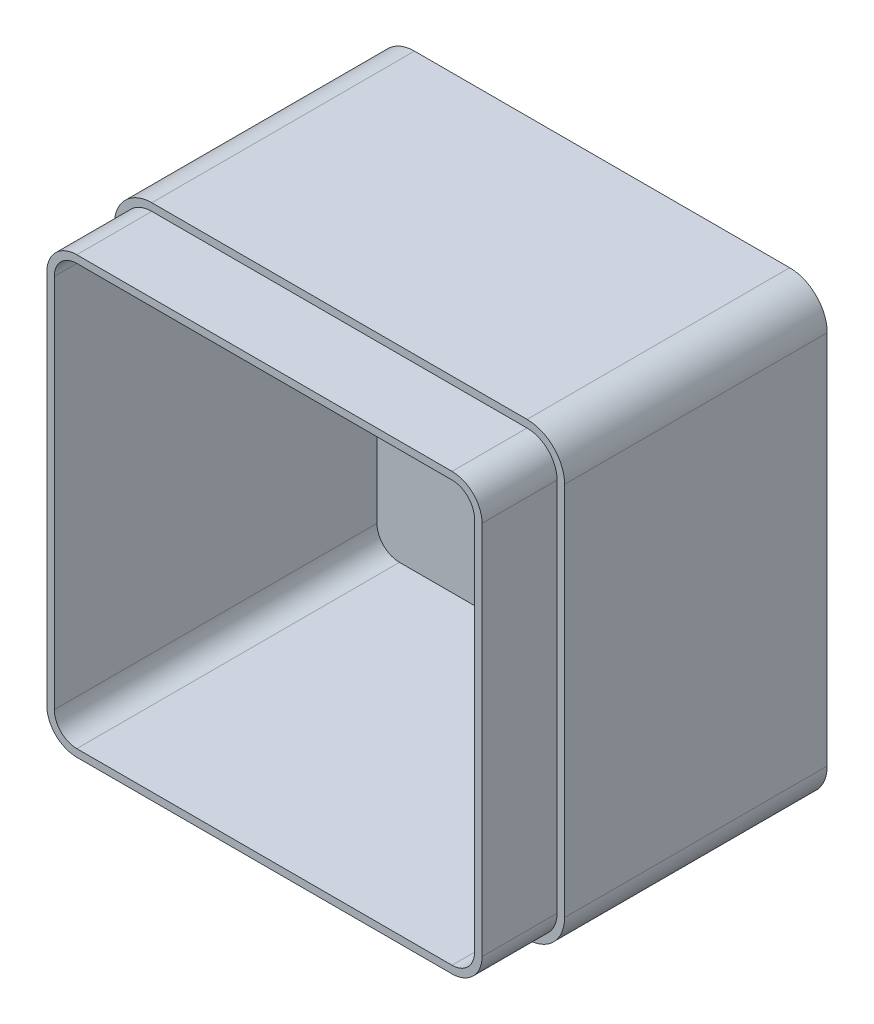
ISO-10303-21;
HEADER;
FILE_DESCRIPTION(('STEP AP214'),'2;1');
FILE_NAME('part.step','',(''),(''),'','','');
FILE_SCHEMA(('AUTOMOTIVE_DESIGN { 1 0 10303 214 1 1 1 1 }'));
ENDSEC;
DATA;
#1=APPLICATION_CONTEXT('core data for automotive mechanical design processes');
#2=APPLICATION_PROTOCOL_DEFINITION('international standard','automotive_design',2000,#1);
#3=PRODUCT_CONTEXT('',#1,'mechanical');
#4=PRODUCT('Part','Part','',(#3));
#5=PRODUCT_RELATED_PRODUCT_CATEGORY('part','',(#4));
#6=PRODUCT_DEFINITION_FORMATION('','',#4);
#7=PRODUCT_DEFINITION_CONTEXT('part definition',#1,'design');
#8=PRODUCT_DEFINITION('design','',#6,#7);
#9=PRODUCT_DEFINITION_SHAPE('','',#8);
#10=(LENGTH_UNIT() NAMED_UNIT(*) SI_UNIT(.MILLI.,.METRE.));
#11=(NAMED_UNIT(*) PLANE_ANGLE_UNIT() SI_UNIT($,.RADIAN.));
#12=(NAMED_UNIT(*) SI_UNIT($,.STERADIAN.) SOLID_ANGLE_UNIT());
#13=UNCERTAINTY_MEASURE_WITH_UNIT(LENGTH_MEASURE(1.E-05),#10,'distance_accuracy_value','');
#14=(GEOMETRIC_REPRESENTATION_CONTEXT(3) GLOBAL_UNCERTAINTY_ASSIGNED_CONTEXT((#13)) GLOBAL_UNIT_ASSIGNED_CONTEXT((#10,
#11,#12)) REPRESENTATION_CONTEXT('',''));
#15=CARTESIAN_POINT('',(0.,0.,0.));
#16=DIRECTION('',(0.,0.,1.));
#17=DIRECTION('',(1.,0.,0.));
#18=AXIS2_PLACEMENT_3D('',#15,#16,#17);
#19=CARTESIAN_POINT('',(0.,0.,90.));
#20=DIRECTION('',(0.,0.,-1.));
#21=DIRECTION('',(-1.,0.,0.));
#22=AXIS2_PLACEMENT_3D('',#19,#20,#21);
#23=PLANE('',#22);
#24=DIRECTION('',(0.,-1.,0.));
#25=VECTOR('',#24,1.);
#26=CARTESIAN_POINT('',(-116.,0.,90.));
#27=LINE('',#26,#25);
#28=CARTESIAN_POINT('',(-116.,-9.99999999999999,90.));
#29=VERTEX_POINT('',#28);
#30=CARTESIAN_POINT('',(-116.,-110.,90.));
#31=VERTEX_POINT('',#30);
#32=EDGE_CURVE('E392',#29,#31,#27,.T.);
#33=ORIENTED_EDGE('',*,*,#32,.F.);
#34=CARTESIAN_POINT('',(-110.,-10.,90.));
#35=DIRECTION('',(0.,0.,-1.));
#36=DIRECTION('',(-1.,0.,0.));
#37=AXIS2_PLACEMENT_3D('',#34,#35,#36);
#38=CIRCLE('',#37,6.);
#39=CARTESIAN_POINT('',(-110.,-4.,90.));
#40=VERTEX_POINT('',#39);
#41=EDGE_CURVE('E374',#40,#29,#38,.F.);
#42=ORIENTED_EDGE('',*,*,#41,.F.);
#43=DIRECTION('',(-1.,0.,0.));
#44=VECTOR('',#43,1.);
#45=CARTESIAN_POINT('',(0.,-4.,90.));
#46=LINE('',#45,#44);
#47=CARTESIAN_POINT('',(-9.99999999999999,-4.,90.));
#48=VERTEX_POINT('',#47);
#49=EDGE_CURVE('E385',#48,#40,#46,.T.);
#50=ORIENTED_EDGE('',*,*,#49,.F.);
#51=CARTESIAN_POINT('',(-9.99999999999999,-10.,90.));
#52=DIRECTION('',(0.,0.,-1.));
#53=DIRECTION('',(-1.,0.,0.));
#54=AXIS2_PLACEMENT_3D('',#51,#52,#53);
#55=CIRCLE('',#54,6.);
#56=CARTESIAN_POINT('',(-4.,-10.,90.));
#57=VERTEX_POINT('',#56);
#58=EDGE_CURVE('E386',#57,#48,#55,.F.);
#59=ORIENTED_EDGE('',*,*,#58,.F.);
#60=DIRECTION('',(0.,1.,0.));
#61=VECTOR('',#60,1.);
#62=CARTESIAN_POINT('',(-4.,0.,90.));
#63=LINE('',#62,#61);
#64=CARTESIAN_POINT('',(-3.99999999999999,-110.,90.));
#65=VERTEX_POINT('',#64);
#66=EDGE_CURVE('E338',#65,#57,#63,.T.);
#67=ORIENTED_EDGE('',*,*,#66,.F.);
#68=CARTESIAN_POINT('',(-9.99999999999998,-110.,90.));
#69=DIRECTION('',(0.,0.,-1.));
#70=DIRECTION('',(-1.,0.,0.));
#71=AXIS2_PLACEMENT_3D('',#68,#69,#70);
#72=CIRCLE('',#71,6.);
#73=CARTESIAN_POINT('',(-9.99999999999998,-116.,90.));
#74=VERTEX_POINT('',#73);
#75=EDGE_CURVE('E389',#74,#65,#72,.F.);
#76=ORIENTED_EDGE('',*,*,#75,.F.);
#77=DIRECTION('',(1.,0.,0.));
#78=VECTOR('',#77,1.);
#79=CARTESIAN_POINT('',(0.,-116.,90.));
#80=LINE('',#79,#78);
#81=CARTESIAN_POINT('',(-110.,-116.,90.));
#82=VERTEX_POINT('',#81);
#83=EDGE_CURVE('E381',#82,#74,#80,.T.);
#84=ORIENTED_EDGE('',*,*,#83,.F.);
#85=CARTESIAN_POINT('',(-110.,-110.,90.));
#86=DIRECTION('',(0.,0.,-1.));
#87=DIRECTION('',(-1.,0.,0.));
#88=AXIS2_PLACEMENT_3D('',#85,#86,#87);
#89=CIRCLE('',#88,6.);
#90=EDGE_CURVE('E333',#31,#82,#89,.F.);
#91=ORIENTED_EDGE('',*,*,#90,.F.);
#92=EDGE_LOOP('',(#33,#42,#50,#59,#67,#76,#84,#91));
#93=FACE_BOUND('',#92,.T.);
#94=CARTESIAN_POINT('',(-110.,-10.,90.));
#95=DIRECTION('',(0.,0.,1.));
#96=DIRECTION('',(1.,0.,0.));
#97=AXIS2_PLACEMENT_3D('',#94,#95,#96);
#98=CIRCLE('',#97,7.99999999999999);
#99=CARTESIAN_POINT('',(-110.,-2.,90.));
#100=VERTEX_POINT('',#99);
#101=CARTESIAN_POINT('',(-118.,-9.99999999999999,90.));
#102=VERTEX_POINT('',#101);
#103=EDGE_CURVE('E256',#100,#102,#98,.T.);
#104=ORIENTED_EDGE('',*,*,#103,.T.);
#105=DIRECTION('',(0.,-1.,0.));
#106=VECTOR('',#105,1.);
#107=CARTESIAN_POINT('',(-118.,-9.99999999999999,90.));
#108=LINE('',#107,#106);
#109=CARTESIAN_POINT('',(-118.,-110.,90.));
#110=VERTEX_POINT('',#109);
#111=EDGE_CURVE('E206',#102,#110,#108,.T.);
#112=ORIENTED_EDGE('',*,*,#111,.T.);
#113=CARTESIAN_POINT('',(-110.,-110.,90.));
#114=DIRECTION('',(0.,0.,1.));
#115=DIRECTION('',(1.,0.,0.));
#116=AXIS2_PLACEMENT_3D('',#113,#114,#115);
#117=CIRCLE('',#116,8.00000000000001);
#118=CARTESIAN_POINT('',(-110.,-118.,90.));
#119=VERTEX_POINT('',#118);
#120=EDGE_CURVE('E55',#110,#119,#117,.T.);
#121=ORIENTED_EDGE('',*,*,#120,.T.);
#122=DIRECTION('',(1.,0.,0.));
#123=VECTOR('',#122,1.);
#124=CARTESIAN_POINT('',(-110.,-118.,90.));
#125=LINE('',#124,#123);
#126=CARTESIAN_POINT('',(-9.99999999999998,-118.,90.));
#127=VERTEX_POINT('',#126);
#128=EDGE_CURVE('E263',#119,#127,#125,.T.);
#129=ORIENTED_EDGE('',*,*,#128,.T.);
#130=CARTESIAN_POINT('',(-9.99999999999998,-110.,90.));
#131=DIRECTION('',(0.,0.,1.));
#132=DIRECTION('',(1.,0.,0.));
#133=AXIS2_PLACEMENT_3D('',#130,#131,#132);
#134=CIRCLE('',#133,8.);
#135=CARTESIAN_POINT('',(-1.99999999999998,-110.,90.));
#136=VERTEX_POINT('',#135);
#137=EDGE_CURVE('E267',#127,#136,#134,.T.);
#138=ORIENTED_EDGE('',*,*,#137,.T.);
#139=DIRECTION('',(0.,1.,0.));
#140=VECTOR('',#139,1.);
#141=CARTESIAN_POINT('',(-1.99999999999999,-110.,90.));
#142=LINE('',#141,#140);
#143=CARTESIAN_POINT('',(-1.99999999999999,-9.99999999999999,90.));
#144=VERTEX_POINT('',#143);
#145=EDGE_CURVE('E271',#136,#144,#142,.T.);
#146=ORIENTED_EDGE('',*,*,#145,.T.);
#147=CARTESIAN_POINT('',(-9.99999999999999,-10.,90.));
#148=DIRECTION('',(0.,0.,1.));
#149=DIRECTION('',(1.,0.,0.));
#150=AXIS2_PLACEMENT_3D('',#147,#148,#149);
#151=CIRCLE('',#150,8.);
#152=CARTESIAN_POINT('',(-9.99999999999999,-1.99999999999999,90.));
#153=VERTEX_POINT('',#152);
#154=EDGE_CURVE('E233',#144,#153,#151,.T.);
#155=ORIENTED_EDGE('',*,*,#154,.T.);
#156=DIRECTION('',(-1.,0.,0.));
#157=VECTOR('',#156,1.);
#158=CARTESIAN_POINT('',(-9.99999999999999,-2.,90.));
#159=LINE('',#158,#157);
#160=EDGE_CURVE('E229',#153,#100,#159,.T.);
#161=ORIENTED_EDGE('',*,*,#160,.T.);
#162=EDGE_LOOP('',(#104,#112,#121,#129,#138,#146,#155,#161));
#163=FACE_BOUND('',#162,.T.);
#164=ADVANCED_FACE('F39',(#93,#163),#23,.F.);
#165=CARTESIAN_POINT('',(-4.,0.,90.));
#166=DIRECTION('',(-1.,0.,0.));
#167=DIRECTION('',(0.,-1.,0.));
#168=AXIS2_PLACEMENT_3D('',#165,#166,#167);
#169=PLANE('',#168);
#170=ORIENTED_EDGE('',*,*,#66,.T.);
#171=DIRECTION('',(0.,0.,1.));
#172=VECTOR('',#171,1.);
#173=CARTESIAN_POINT('',(-4.,-10.,90.));
#174=LINE('',#173,#172);
#175=CARTESIAN_POINT('',(-4.,-10.,4.));
#176=VERTEX_POINT('',#175);
#177=EDGE_CURVE('E326',#176,#57,#174,.T.);
#178=ORIENTED_EDGE('',*,*,#177,.F.);
#179=DIRECTION('',(0.,1.,0.));
#180=VECTOR('',#179,1.);
#181=CARTESIAN_POINT('',(-4.,0.,4.));
#182=LINE('',#181,#180);
#183=CARTESIAN_POINT('',(-3.99999999999999,-110.,4.));
#184=VERTEX_POINT('',#183);
#185=EDGE_CURVE('E320',#184,#176,#182,.T.);
#186=ORIENTED_EDGE('',*,*,#185,.F.);
#187=DIRECTION('',(0.,0.,1.));
#188=VECTOR('',#187,1.);
#189=CARTESIAN_POINT('',(-3.99999999999999,-110.,90.));
#190=LINE('',#189,#188);
#191=EDGE_CURVE('E321',#65,#184,#190,.F.);
#192=ORIENTED_EDGE('',*,*,#191,.F.);
#193=EDGE_LOOP('',(#170,#178,#186,#192));
#194=FACE_BOUND('',#193,.T.);
#195=ADVANCED_FACE('F505',(#194),#169,.T.);
#196=CARTESIAN_POINT('',(0.,-4.,90.));
#197=DIRECTION('',(0.,-1.,0.));
#198=DIRECTION('',(0.,0.,-1.));
#199=AXIS2_PLACEMENT_3D('',#196,#197,#198);
#200=PLANE('',#199);
#201=ORIENTED_EDGE('',*,*,#49,.T.);
#202=DIRECTION('',(0.,0.,-1.));
#203=VECTOR('',#202,1.);
#204=CARTESIAN_POINT('',(-110.,-4.,90.));
#205=LINE('',#204,#203);
#206=CARTESIAN_POINT('',(-110.,-4.,4.));
#207=VERTEX_POINT('',#206);
#208=EDGE_CURVE('E325',#207,#40,#205,.F.);
#209=ORIENTED_EDGE('',*,*,#208,.F.);
#210=DIRECTION('',(-1.,0.,0.));
#211=VECTOR('',#210,1.);
#212=CARTESIAN_POINT('',(0.,-4.,4.));
#213=LINE('',#212,#211);
#214=CARTESIAN_POINT('',(-9.99999999999999,-4.,4.));
#215=VERTEX_POINT('',#214);
#216=EDGE_CURVE('E330',#215,#207,#213,.T.);
#217=ORIENTED_EDGE('',*,*,#216,.F.);
#218=DIRECTION('',(0.,0.,-1.));
#219=VECTOR('',#218,1.);
#220=CARTESIAN_POINT('',(-9.99999999999999,-4.,90.));
#221=LINE('',#220,#219);
#222=EDGE_CURVE('E360',#48,#215,#221,.T.);
#223=ORIENTED_EDGE('',*,*,#222,.F.);
#224=EDGE_LOOP('',(#201,#209,#217,#223));
#225=FACE_BOUND('',#224,.T.);
#226=ADVANCED_FACE('F510',(#225),#200,.T.);
#227=CARTESIAN_POINT('',(-116.,0.,90.));
#228=DIRECTION('',(1.,0.,0.));
#229=DIRECTION('',(0.,1.,0.));
#230=AXIS2_PLACEMENT_3D('',#227,#228,#229);
#231=PLANE('',#230);
#232=DIRECTION('',(0.,-1.,0.));
#233=VECTOR('',#232,1.);
#234=CARTESIAN_POINT('',(-116.,0.,4.));
#235=LINE('',#234,#233);
#236=CARTESIAN_POINT('',(-116.,-9.99999999999999,4.));
#237=VERTEX_POINT('',#236);
#238=CARTESIAN_POINT('',(-116.,-110.,4.));
#239=VERTEX_POINT('',#238);
#240=EDGE_CURVE('E339',#237,#239,#235,.T.);
#241=ORIENTED_EDGE('',*,*,#240,.F.);
#242=DIRECTION('',(0.,0.,1.));
#243=VECTOR('',#242,1.);
#244=CARTESIAN_POINT('',(-116.,-9.99999999999999,90.));
#245=LINE('',#244,#243);
#246=EDGE_CURVE('E343',#29,#237,#245,.F.);
#247=ORIENTED_EDGE('',*,*,#246,.F.);
#248=ORIENTED_EDGE('',*,*,#32,.T.);
#249=DIRECTION('',(0.,0.,1.));
#250=VECTOR('',#249,1.);
#251=CARTESIAN_POINT('',(-116.,-110.,90.));
#252=LINE('',#251,#250);
#253=EDGE_CURVE('E371',#239,#31,#252,.T.);
#254=ORIENTED_EDGE('',*,*,#253,.F.);
#255=EDGE_LOOP('',(#241,#247,#248,#254));
#256=FACE_BOUND('',#255,.T.);
#257=ADVANCED_FACE('F539',(#256),#231,.T.);
#258=CARTESIAN_POINT('',(0.,-116.,90.));
#259=DIRECTION('',(0.,1.,0.));
#260=DIRECTION('',(-1.,0.,0.));
#261=AXIS2_PLACEMENT_3D('',#258,#259,#260);
#262=PLANE('',#261);
#263=ORIENTED_EDGE('',*,*,#83,.T.);
#264=DIRECTION('',(0.,0.,1.));
#265=VECTOR('',#264,1.);
#266=CARTESIAN_POINT('',(-9.99999999999998,-116.,90.));
#267=LINE('',#266,#265);
#268=CARTESIAN_POINT('',(-9.99999999999998,-116.,4.));
#269=VERTEX_POINT('',#268);
#270=EDGE_CURVE('E378',#269,#74,#267,.T.);
#271=ORIENTED_EDGE('',*,*,#270,.F.);
#272=DIRECTION('',(1.,0.,0.));
#273=VECTOR('',#272,1.);
#274=CARTESIAN_POINT('',(0.,-116.,4.));
#275=LINE('',#274,#273);
#276=CARTESIAN_POINT('',(-110.,-116.,4.));
#277=VERTEX_POINT('',#276);
#278=EDGE_CURVE('E334',#277,#269,#275,.T.);
#279=ORIENTED_EDGE('',*,*,#278,.F.);
#280=DIRECTION('',(0.,0.,1.));
#281=VECTOR('',#280,1.);
#282=CARTESIAN_POINT('',(-110.,-116.,90.));
#283=LINE('',#282,#281);
#284=EDGE_CURVE('E352',#82,#277,#283,.F.);
#285=ORIENTED_EDGE('',*,*,#284,.F.);
#286=EDGE_LOOP('',(#263,#271,#279,#285));
#287=FACE_BOUND('',#286,.T.);
#288=ADVANCED_FACE('F535',(#287),#262,.T.);
#289=CARTESIAN_POINT('',(0.,0.,4.));
#290=DIRECTION('',(0.,0.,-1.));
#291=DIRECTION('',(-1.,0.,0.));
#292=AXIS2_PLACEMENT_3D('',#289,#290,#291);
#293=PLANE('',#292);
#294=ORIENTED_EDGE('',*,*,#278,.T.);
#295=CARTESIAN_POINT('',(-9.99999999999998,-110.,4.));
#296=DIRECTION('',(0.,0.,-1.));
#297=DIRECTION('',(-1.,0.,0.));
#298=AXIS2_PLACEMENT_3D('',#295,#296,#297);
#299=CIRCLE('',#298,6.);
#300=EDGE_CURVE('E344',#184,#269,#299,.T.);
#301=ORIENTED_EDGE('',*,*,#300,.F.);
#302=ORIENTED_EDGE('',*,*,#185,.T.);
#303=CARTESIAN_POINT('',(-9.99999999999999,-10.,4.));
#304=DIRECTION('',(0.,0.,-1.));
#305=DIRECTION('',(-1.,0.,0.));
#306=AXIS2_PLACEMENT_3D('',#303,#304,#305);
#307=CIRCLE('',#306,6.);
#308=EDGE_CURVE('E351',#215,#176,#307,.T.);
#309=ORIENTED_EDGE('',*,*,#308,.F.);
#310=ORIENTED_EDGE('',*,*,#216,.T.);
#311=CARTESIAN_POINT('',(-110.,-10.,4.));
#312=DIRECTION('',(0.,0.,-1.));
#313=DIRECTION('',(-1.,0.,0.));
#314=AXIS2_PLACEMENT_3D('',#311,#312,#313);
#315=CIRCLE('',#314,6.);
#316=EDGE_CURVE('E348',#237,#207,#315,.T.);
#317=ORIENTED_EDGE('',*,*,#316,.F.);
#318=ORIENTED_EDGE('',*,*,#240,.T.);
#319=CARTESIAN_POINT('',(-110.,-110.,4.));
#320=DIRECTION('',(0.,0.,-1.));
#321=DIRECTION('',(-1.,0.,0.));
#322=AXIS2_PLACEMENT_3D('',#319,#320,#321);
#323=CIRCLE('',#322,6.);
#324=EDGE_CURVE('E340',#277,#239,#323,.T.);
#325=ORIENTED_EDGE('',*,*,#324,.F.);
#326=EDGE_LOOP('',(#294,#301,#302,#309,#310,#317,#318,#325));
#327=FACE_BOUND('',#326,.T.);
#328=ADVANCED_FACE('F531',(#327),#293,.F.);
#329=CARTESIAN_POINT('',(-110.,-110.,90.));
#330=DIRECTION('',(0.,0.,-1.));
#331=DIRECTION('',(-1.,0.,0.));
#332=AXIS2_PLACEMENT_3D('',#329,#330,#331);
#333=CYLINDRICAL_SURFACE('',#332,6.);
#334=ORIENTED_EDGE('',*,*,#90,.T.);
#335=ORIENTED_EDGE('',*,*,#284,.T.);
#336=ORIENTED_EDGE('',*,*,#324,.T.);
#337=ORIENTED_EDGE('',*,*,#253,.T.);
#338=EDGE_LOOP('',(#334,#335,#336,#337));
#339=FACE_BOUND('',#338,.T.);
#340=ADVANCED_FACE('F527',(#339),#333,.F.);
#341=CARTESIAN_POINT('',(-9.99999999999998,-110.,90.));
#342=DIRECTION('',(0.,0.,-1.));
#343=DIRECTION('',(-1.,0.,0.));
#344=AXIS2_PLACEMENT_3D('',#341,#342,#343);
#345=CYLINDRICAL_SURFACE('',#344,6.);
#346=ORIENTED_EDGE('',*,*,#75,.T.);
#347=ORIENTED_EDGE('',*,*,#191,.T.);
#348=ORIENTED_EDGE('',*,*,#300,.T.);
#349=ORIENTED_EDGE('',*,*,#270,.T.);
#350=EDGE_LOOP('',(#346,#347,#348,#349));
#351=FACE_BOUND('',#350,.T.);
#352=ADVANCED_FACE('F523',(#351),#345,.F.);
#353=CARTESIAN_POINT('',(-9.99999999999999,-10.,90.));
#354=DIRECTION('',(0.,0.,-1.));
#355=DIRECTION('',(-1.,0.,0.));
#356=AXIS2_PLACEMENT_3D('',#353,#354,#355);
#357=CYLINDRICAL_SURFACE('',#356,6.);
#358=ORIENTED_EDGE('',*,*,#58,.T.);
#359=ORIENTED_EDGE('',*,*,#222,.T.);
#360=ORIENTED_EDGE('',*,*,#308,.T.);
#361=ORIENTED_EDGE('',*,*,#177,.T.);
#362=EDGE_LOOP('',(#358,#359,#360,#361));
#363=FACE_BOUND('',#362,.T.);
#364=ADVANCED_FACE('F519',(#363),#357,.F.);
#365=CARTESIAN_POINT('',(-110.,-10.,90.));
#366=DIRECTION('',(0.,0.,-1.));
#367=DIRECTION('',(-1.,0.,0.));
#368=AXIS2_PLACEMENT_3D('',#365,#366,#367);
#369=CYLINDRICAL_SURFACE('',#368,6.);
#370=ORIENTED_EDGE('',*,*,#41,.T.);
#371=ORIENTED_EDGE('',*,*,#246,.T.);
#372=ORIENTED_EDGE('',*,*,#316,.T.);
#373=ORIENTED_EDGE('',*,*,#208,.T.);
#374=EDGE_LOOP('',(#370,#371,#372,#373));
#375=FACE_BOUND('',#374,.T.);
#376=ADVANCED_FACE('F516',(#375),#369,.F.);
#377=CARTESIAN_POINT('',(-110.,-10.,70.));
#378=DIRECTION('',(0.,0.,1.));
#379=DIRECTION('',(1.,0.,0.));
#380=AXIS2_PLACEMENT_3D('',#377,#378,#379);
#381=PLANE('',#380);
#382=DIRECTION('',(-1.,0.,0.));
#383=VECTOR('',#382,1.);
#384=CARTESIAN_POINT('',(-9.99999999999999,-2.,70.));
#385=LINE('',#384,#383);
#386=CARTESIAN_POINT('',(-9.99999999999999,-1.99999999999999,70.));
#387=VERTEX_POINT('',#386);
#388=CARTESIAN_POINT('',(-110.,-2.,70.));
#389=VERTEX_POINT('',#388);
#390=EDGE_CURVE('E213',#387,#389,#385,.T.);
#391=ORIENTED_EDGE('',*,*,#390,.F.);
#392=CARTESIAN_POINT('',(-9.99999999999999,-10.,70.));
#393=DIRECTION('',(0.,0.,1.));
#394=DIRECTION('',(1.,0.,0.));
#395=AXIS2_PLACEMENT_3D('',#392,#393,#394);
#396=CIRCLE('',#395,8.);
#397=CARTESIAN_POINT('',(-1.99999999999999,-9.99999999999999,70.));
#398=VERTEX_POINT('',#397);
#399=EDGE_CURVE('E250',#398,#387,#396,.T.);
#400=ORIENTED_EDGE('',*,*,#399,.F.);
#401=DIRECTION('',(0.,1.,0.));
#402=VECTOR('',#401,1.);
#403=CARTESIAN_POINT('',(-1.99999999999999,-110.,70.));
#404=LINE('',#403,#402);
#405=CARTESIAN_POINT('',(-1.99999999999998,-110.,70.));
#406=VERTEX_POINT('',#405);
#407=EDGE_CURVE('E246',#406,#398,#404,.T.);
#408=ORIENTED_EDGE('',*,*,#407,.F.);
#409=CARTESIAN_POINT('',(-9.99999999999998,-110.,70.));
#410=DIRECTION('',(0.,0.,1.));
#411=DIRECTION('',(1.,0.,0.));
#412=AXIS2_PLACEMENT_3D('',#409,#410,#411);
#413=CIRCLE('',#412,8.);
#414=CARTESIAN_POINT('',(-9.99999999999998,-118.,70.));
#415=VERTEX_POINT('',#414);
#416=EDGE_CURVE('E242',#415,#406,#413,.T.);
#417=ORIENTED_EDGE('',*,*,#416,.F.);
#418=DIRECTION('',(1.,0.,0.));
#419=VECTOR('',#418,1.);
#420=CARTESIAN_POINT('',(-110.,-118.,70.));
#421=LINE('',#420,#419);
#422=CARTESIAN_POINT('',(-110.,-118.,70.));
#423=VERTEX_POINT('',#422);
#424=EDGE_CURVE('E238',#423,#415,#421,.T.);
#425=ORIENTED_EDGE('',*,*,#424,.F.);
#426=CARTESIAN_POINT('',(-110.,-110.,70.));
#427=DIRECTION('',(0.,0.,1.));
#428=DIRECTION('',(1.,0.,0.));
#429=AXIS2_PLACEMENT_3D('',#426,#427,#428);
#430=CIRCLE('',#429,8.00000000000001);
#431=CARTESIAN_POINT('',(-118.,-110.,70.));
#432=VERTEX_POINT('',#431);
#433=EDGE_CURVE('E223',#432,#423,#430,.T.);
#434=ORIENTED_EDGE('',*,*,#433,.F.);
#435=DIRECTION('',(0.,-1.,0.));
#436=VECTOR('',#435,1.);
#437=CARTESIAN_POINT('',(-118.,-9.99999999999999,70.));
#438=LINE('',#437,#436);
#439=CARTESIAN_POINT('',(-118.,-9.99999999999999,70.));
#440=VERTEX_POINT('',#439);
#441=EDGE_CURVE('E204',#440,#432,#438,.T.);
#442=ORIENTED_EDGE('',*,*,#441,.F.);
#443=CARTESIAN_POINT('',(-110.,-10.,70.));
#444=DIRECTION('',(0.,0.,1.));
#445=DIRECTION('',(1.,0.,0.));
#446=AXIS2_PLACEMENT_3D('',#443,#444,#445);
#447=CIRCLE('',#446,7.99999999999999);
#448=EDGE_CURVE('E219',#389,#440,#447,.T.);
#449=ORIENTED_EDGE('',*,*,#448,.F.);
#450=EDGE_LOOP('',(#391,#400,#408,#417,#425,#434,#442,#449));
#451=FACE_BOUND('',#450,.T.);
#452=CARTESIAN_POINT('',(-110.,-10.,70.));
#453=DIRECTION('',(0.,0.,1.));
#454=DIRECTION('',(1.,0.,0.));
#455=AXIS2_PLACEMENT_3D('',#452,#453,#454);
#456=CIRCLE('',#455,9.99999999999999);
#457=CARTESIAN_POINT('',(-110.,0.,70.));
#458=VERTEX_POINT('',#457);
#459=CARTESIAN_POINT('',(-120.,-9.99999999999999,70.));
#460=VERTEX_POINT('',#459);
#461=EDGE_CURVE('E280',#458,#460,#456,.T.);
#462=ORIENTED_EDGE('',*,*,#461,.T.);
#463=DIRECTION('',(0.,-1.,0.));
#464=VECTOR('',#463,1.);
#465=CARTESIAN_POINT('',(-120.,-9.99999999999999,70.));
#466=LINE('',#465,#464);
#467=CARTESIAN_POINT('',(-120.,-110.,70.));
#468=VERTEX_POINT('',#467);
#469=EDGE_CURVE('E300',#460,#468,#466,.T.);
#470=ORIENTED_EDGE('',*,*,#469,.T.);
#471=CARTESIAN_POINT('',(-110.,-110.,70.));
#472=DIRECTION('',(0.,0.,1.));
#473=DIRECTION('',(1.,0.,0.));
#474=AXIS2_PLACEMENT_3D('',#471,#472,#473);
#475=CIRCLE('',#474,9.99999999999999);
#476=CARTESIAN_POINT('',(-110.,-120.,70.));
#477=VERTEX_POINT('',#476);
#478=EDGE_CURVE('E303',#468,#477,#475,.T.);
#479=ORIENTED_EDGE('',*,*,#478,.T.);
#480=DIRECTION('',(1.,0.,0.));
#481=VECTOR('',#480,1.);
#482=CARTESIAN_POINT('',(-110.,-120.,70.));
#483=LINE('',#482,#481);
#484=CARTESIAN_POINT('',(-9.99999999999998,-120.,70.));
#485=VERTEX_POINT('',#484);
#486=EDGE_CURVE('E306',#477,#485,#483,.T.);
#487=ORIENTED_EDGE('',*,*,#486,.T.);
#488=CARTESIAN_POINT('',(-9.99999999999998,-110.,70.));
#489=DIRECTION('',(0.,0.,1.));
#490=DIRECTION('',(1.,0.,0.));
#491=AXIS2_PLACEMENT_3D('',#488,#489,#490);
#492=CIRCLE('',#491,9.99999999999999);
#493=CARTESIAN_POINT('',(0.,-110.,70.));
#494=VERTEX_POINT('',#493);
#495=EDGE_CURVE('E309',#485,#494,#492,.T.);
#496=ORIENTED_EDGE('',*,*,#495,.T.);
#497=DIRECTION('',(0.,1.,0.));
#498=VECTOR('',#497,1.);
#499=CARTESIAN_POINT('',(0.,-110.,70.));
#500=LINE('',#499,#498);
#501=CARTESIAN_POINT('',(0.,-10.,70.));
#502=VERTEX_POINT('',#501);
#503=EDGE_CURVE('E312',#494,#502,#500,.T.);
#504=ORIENTED_EDGE('',*,*,#503,.T.);
#505=CARTESIAN_POINT('',(-9.99999999999999,-10.,70.));
#506=DIRECTION('',(0.,0.,1.));
#507=DIRECTION('',(1.,0.,0.));
#508=AXIS2_PLACEMENT_3D('',#505,#506,#507);
#509=CIRCLE('',#508,10.);
#510=CARTESIAN_POINT('',(-9.99999999999999,0.,70.));
#511=VERTEX_POINT('',#510);
#512=EDGE_CURVE('E315',#502,#511,#509,.T.);
#513=ORIENTED_EDGE('',*,*,#512,.T.);
#514=DIRECTION('',(-1.,0.,0.));
#515=VECTOR('',#514,1.);
#516=CARTESIAN_POINT('',(-9.99999999999999,0.,70.));
#517=LINE('',#516,#515);
#518=EDGE_CURVE('E63',#511,#458,#517,.T.);
#519=ORIENTED_EDGE('',*,*,#518,.T.);
#520=EDGE_LOOP('',(#462,#470,#479,#487,#496,#504,#513,#519));
#521=FACE_BOUND('',#520,.T.);
#522=ADVANCED_FACE('F218',(#451,#521),#381,.T.);
#523=CARTESIAN_POINT('',(-110.,-10.,70.));
#524=DIRECTION('',(0.,0.,1.));
#525=DIRECTION('',(1.,0.,0.));
#526=AXIS2_PLACEMENT_3D('',#523,#524,#525);
#527=CYLINDRICAL_SURFACE('',#526,7.99999999999999);
#528=ORIENTED_EDGE('',*,*,#103,.F.);
#529=DIRECTION('',(0.,0.,1.));
#530=VECTOR('',#529,1.);
#531=CARTESIAN_POINT('',(-110.,-2.,70.));
#532=LINE('',#531,#530);
#533=EDGE_CURVE('E227',#389,#100,#532,.T.);
#534=ORIENTED_EDGE('',*,*,#533,.F.);
#535=ORIENTED_EDGE('',*,*,#448,.T.);
#536=DIRECTION('',(0.,0.,1.));
#537=VECTOR('',#536,1.);
#538=CARTESIAN_POINT('',(-118.,-9.99999999999999,70.));
#539=LINE('',#538,#537);
#540=EDGE_CURVE('E201',#440,#102,#539,.T.);
#541=ORIENTED_EDGE('',*,*,#540,.T.);
#542=EDGE_LOOP('',(#528,#534,#535,#541));
#543=FACE_BOUND('',#542,.T.);
#544=ADVANCED_FACE('F226',(#543),#527,.T.);
#545=CARTESIAN_POINT('',(-9.99999999999999,-2.,70.));
#546=DIRECTION('',(0.,1.,0.));
#547=DIRECTION('',(0.,0.,1.));
#548=AXIS2_PLACEMENT_3D('',#545,#546,#547);
#549=PLANE('',#548);
#550=ORIENTED_EDGE('',*,*,#160,.F.);
#551=DIRECTION('',(0.,0.,1.));
#552=VECTOR('',#551,1.);
#553=CARTESIAN_POINT('',(-9.99999999999999,-1.99999999999999,70.));
#554=LINE('',#553,#552);
#555=EDGE_CURVE('E281',#387,#153,#554,.T.);
#556=ORIENTED_EDGE('',*,*,#555,.F.);
#557=ORIENTED_EDGE('',*,*,#390,.T.);
#558=ORIENTED_EDGE('',*,*,#533,.T.);
#559=EDGE_LOOP('',(#550,#556,#557,#558));
#560=FACE_BOUND('',#559,.T.);
#561=ADVANCED_FACE('F550',(#560),#549,.T.);
#562=CARTESIAN_POINT('',(-9.99999999999999,-10.,70.));
#563=DIRECTION('',(0.,0.,1.));
#564=DIRECTION('',(1.,0.,0.));
#565=AXIS2_PLACEMENT_3D('',#562,#563,#564);
#566=CYLINDRICAL_SURFACE('',#565,8.);
#567=ORIENTED_EDGE('',*,*,#154,.F.);
#568=DIRECTION('',(0.,0.,1.));
#569=VECTOR('',#568,1.);
#570=CARTESIAN_POINT('',(-1.99999999999999,-9.99999999999999,70.));
#571=LINE('',#570,#569);
#572=EDGE_CURVE('E284',#398,#144,#571,.T.);
#573=ORIENTED_EDGE('',*,*,#572,.F.);
#574=ORIENTED_EDGE('',*,*,#399,.T.);
#575=ORIENTED_EDGE('',*,*,#555,.T.);
#576=EDGE_LOOP('',(#567,#573,#574,#575));
#577=FACE_BOUND('',#576,.T.);
#578=ADVANCED_FACE('F565',(#577),#566,.T.);
#579=CARTESIAN_POINT('',(-1.99999999999999,-110.,70.));
#580=DIRECTION('',(1.,0.,0.));
#581=DIRECTION('',(0.,1.,0.));
#582=AXIS2_PLACEMENT_3D('',#579,#580,#581);
#583=PLANE('',#582);
#584=ORIENTED_EDGE('',*,*,#145,.F.);
#585=DIRECTION('',(0.,0.,1.));
#586=VECTOR('',#585,1.);
#587=CARTESIAN_POINT('',(-1.99999999999998,-110.,70.));
#588=LINE('',#587,#586);
#589=EDGE_CURVE('E287',#406,#136,#588,.T.);
#590=ORIENTED_EDGE('',*,*,#589,.F.);
#591=ORIENTED_EDGE('',*,*,#407,.T.);
#592=ORIENTED_EDGE('',*,*,#572,.T.);
#593=EDGE_LOOP('',(#584,#590,#591,#592));
#594=FACE_BOUND('',#593,.T.);
#595=ADVANCED_FACE('F561',(#594),#583,.T.);
#596=CARTESIAN_POINT('',(-9.99999999999998,-110.,70.));
#597=DIRECTION('',(0.,0.,1.));
#598=DIRECTION('',(1.,0.,0.));
#599=AXIS2_PLACEMENT_3D('',#596,#597,#598);
#600=CYLINDRICAL_SURFACE('',#599,8.);
#601=ORIENTED_EDGE('',*,*,#137,.F.);
#602=DIRECTION('',(0.,0.,1.));
#603=VECTOR('',#602,1.);
#604=CARTESIAN_POINT('',(-9.99999999999998,-118.,70.));
#605=LINE('',#604,#603);
#606=EDGE_CURVE('E290',#415,#127,#605,.T.);
#607=ORIENTED_EDGE('',*,*,#606,.F.);
#608=ORIENTED_EDGE('',*,*,#416,.T.);
#609=ORIENTED_EDGE('',*,*,#589,.T.);
#610=EDGE_LOOP('',(#601,#607,#608,#609));
#611=FACE_BOUND('',#610,.T.);
#612=ADVANCED_FACE('F557',(#611),#600,.T.);
#613=CARTESIAN_POINT('',(-110.,-118.,70.));
#614=DIRECTION('',(0.,-1.,0.));
#615=DIRECTION('',(0.,0.,-1.));
#616=AXIS2_PLACEMENT_3D('',#613,#614,#615);
#617=PLANE('',#616);
#618=ORIENTED_EDGE('',*,*,#128,.F.);
#619=DIRECTION('',(0.,0.,1.));
#620=VECTOR('',#619,1.);
#621=CARTESIAN_POINT('',(-110.,-118.,70.));
#622=LINE('',#621,#620);
#623=EDGE_CURVE('E293',#423,#119,#622,.T.);
#624=ORIENTED_EDGE('',*,*,#623,.F.);
#625=ORIENTED_EDGE('',*,*,#424,.T.);
#626=ORIENTED_EDGE('',*,*,#606,.T.);
#627=EDGE_LOOP('',(#618,#624,#625,#626));
#628=FACE_BOUND('',#627,.T.);
#629=ADVANCED_FACE('F554',(#628),#617,.T.);
#630=CARTESIAN_POINT('',(-110.,-110.,70.));
#631=DIRECTION('',(0.,0.,1.));
#632=DIRECTION('',(1.,0.,0.));
#633=AXIS2_PLACEMENT_3D('',#630,#631,#632);
#634=CYLINDRICAL_SURFACE('',#633,8.00000000000001);
#635=ORIENTED_EDGE('',*,*,#120,.F.);
#636=DIRECTION('',(0.,0.,1.));
#637=VECTOR('',#636,1.);
#638=CARTESIAN_POINT('',(-118.,-110.,70.));
#639=LINE('',#638,#637);
#640=EDGE_CURVE('E212',#432,#110,#639,.T.);
#641=ORIENTED_EDGE('',*,*,#640,.F.);
#642=ORIENTED_EDGE('',*,*,#433,.T.);
#643=ORIENTED_EDGE('',*,*,#623,.T.);
#644=EDGE_LOOP('',(#635,#641,#642,#643));
#645=FACE_BOUND('',#644,.T.);
#646=ADVANCED_FACE('F500',(#645),#634,.T.);
#647=CARTESIAN_POINT('',(-118.,-9.99999999999999,70.));
#648=DIRECTION('',(-1.,0.,0.));
#649=DIRECTION('',(0.,0.,1.));
#650=AXIS2_PLACEMENT_3D('',#647,#648,#649);
#651=PLANE('',#650);
#652=ORIENTED_EDGE('',*,*,#111,.F.);
#653=ORIENTED_EDGE('',*,*,#540,.F.);
#654=ORIENTED_EDGE('',*,*,#441,.T.);
#655=ORIENTED_EDGE('',*,*,#640,.T.);
#656=EDGE_LOOP('',(#652,#653,#654,#655));
#657=FACE_BOUND('',#656,.T.);
#658=ADVANCED_FACE('F203',(#657),#651,.T.);
#659=CARTESIAN_POINT('',(0.,0.,0.));
#660=DIRECTION('',(0.,0.,-1.));
#661=DIRECTION('',(-1.,0.,0.));
#662=AXIS2_PLACEMENT_3D('',#659,#660,#661);
#663=PLANE('',#662);
#664=DIRECTION('',(1.,0.,0.));
#665=VECTOR('',#664,1.);
#666=CARTESIAN_POINT('',(0.,-120.,0.));
#667=LINE('',#666,#665);
#668=CARTESIAN_POINT('',(-110.,-120.,0.));
#669=VERTEX_POINT('',#668);
#670=CARTESIAN_POINT('',(-9.99999999999998,-120.,0.));
#671=VERTEX_POINT('',#670);
#672=EDGE_CURVE('E416',#669,#671,#667,.T.);
#673=ORIENTED_EDGE('',*,*,#672,.F.);
#674=CARTESIAN_POINT('',(-110.,-110.,0.));
#675=DIRECTION('',(0.,0.,-1.));
#676=DIRECTION('',(-1.,0.,0.));
#677=AXIS2_PLACEMENT_3D('',#674,#675,#676);
#678=CIRCLE('',#677,10.);
#679=CARTESIAN_POINT('',(-120.,-110.,0.));
#680=VERTEX_POINT('',#679);
#681=EDGE_CURVE('E436',#669,#680,#678,.T.);
#682=ORIENTED_EDGE('',*,*,#681,.T.);
#683=DIRECTION('',(0.,-1.,0.));
#684=VECTOR('',#683,1.);
#685=CARTESIAN_POINT('',(-120.,0.,0.));
#686=LINE('',#685,#684);
#687=CARTESIAN_POINT('',(-120.,-9.99999999999999,0.));
#688=VERTEX_POINT('',#687);
#689=EDGE_CURVE('E412',#688,#680,#686,.T.);
#690=ORIENTED_EDGE('',*,*,#689,.F.);
#691=CARTESIAN_POINT('',(-110.,-10.,0.));
#692=DIRECTION('',(0.,0.,-1.));
#693=DIRECTION('',(-1.,0.,0.));
#694=AXIS2_PLACEMENT_3D('',#691,#692,#693);
#695=CIRCLE('',#694,10.);
#696=CARTESIAN_POINT('',(-110.,0.,0.));
#697=VERTEX_POINT('',#696);
#698=EDGE_CURVE('E427',#688,#697,#695,.T.);
#699=ORIENTED_EDGE('',*,*,#698,.T.);
#700=DIRECTION('',(-1.,0.,0.));
#701=VECTOR('',#700,1.);
#702=CARTESIAN_POINT('',(0.,0.,0.));
#703=LINE('',#702,#701);
#704=CARTESIAN_POINT('',(-9.99999999999999,0.,0.));
#705=VERTEX_POINT('',#704);
#706=EDGE_CURVE('E408',#705,#697,#703,.T.);
#707=ORIENTED_EDGE('',*,*,#706,.F.);
#708=CARTESIAN_POINT('',(-9.99999999999999,-10.,0.));
#709=DIRECTION('',(0.,0.,-1.));
#710=DIRECTION('',(-1.,0.,0.));
#711=AXIS2_PLACEMENT_3D('',#708,#709,#710);
#712=CIRCLE('',#711,10.);
#713=CARTESIAN_POINT('',(0.,-10.,0.));
#714=VERTEX_POINT('',#713);
#715=EDGE_CURVE('E430',#705,#714,#712,.T.);
#716=ORIENTED_EDGE('',*,*,#715,.T.);
#717=DIRECTION('',(0.,1.,0.));
#718=VECTOR('',#717,1.);
#719=CARTESIAN_POINT('',(0.,0.,0.));
#720=LINE('',#719,#718);
#721=CARTESIAN_POINT('',(0.,-110.,0.));
#722=VERTEX_POINT('',#721);
#723=EDGE_CURVE('E364',#722,#714,#720,.T.);
#724=ORIENTED_EDGE('',*,*,#723,.F.);
#725=CARTESIAN_POINT('',(-9.99999999999998,-110.,0.));
#726=DIRECTION('',(0.,0.,-1.));
#727=DIRECTION('',(-1.,0.,0.));
#728=AXIS2_PLACEMENT_3D('',#725,#726,#727);
#729=CIRCLE('',#728,10.);
#730=EDGE_CURVE('E433',#722,#671,#729,.T.);
#731=ORIENTED_EDGE('',*,*,#730,.T.);
#732=EDGE_LOOP('',(#673,#682,#690,#699,#707,#716,#724,#731));
#733=FACE_BOUND('',#732,.T.);
#734=ADVANCED_FACE('F492',(#733),#663,.T.);
#735=CARTESIAN_POINT('',(-9.99999999999998,-110.,90.));
#736=DIRECTION('',(0.,0.,-1.));
#737=DIRECTION('',(-1.,0.,0.));
#738=AXIS2_PLACEMENT_3D('',#735,#736,#737);
#739=CYLINDRICAL_SURFACE('',#738,10.);
#740=DIRECTION('',(0.,0.,-1.));
#741=VECTOR('',#740,1.);
#742=CARTESIAN_POINT('',(0.,-110.,90.));
#743=LINE('',#742,#741);
#744=EDGE_CURVE('E450',#494,#722,#743,.T.);
#745=ORIENTED_EDGE('',*,*,#744,.F.);
#746=ORIENTED_EDGE('',*,*,#495,.F.);
#747=DIRECTION('',(0.,0.,-1.));
#748=VECTOR('',#747,1.);
#749=CARTESIAN_POINT('',(-9.99999999999998,-120.,90.));
#750=LINE('',#749,#748);
#751=EDGE_CURVE('E420',#671,#485,#750,.F.);
#752=ORIENTED_EDGE('',*,*,#751,.F.);
#753=ORIENTED_EDGE('',*,*,#730,.F.);
#754=EDGE_LOOP('',(#745,#746,#752,#753));
#755=FACE_BOUND('',#754,.T.);
#756=ADVANCED_FACE('F481',(#755),#739,.T.);
#757=CARTESIAN_POINT('',(-110.,-110.,90.));
#758=DIRECTION('',(0.,0.,-1.));
#759=DIRECTION('',(-1.,0.,0.));
#760=AXIS2_PLACEMENT_3D('',#757,#758,#759);
#761=CYLINDRICAL_SURFACE('',#760,10.);
#762=DIRECTION('',(0.,0.,-1.));
#763=VECTOR('',#762,1.);
#764=CARTESIAN_POINT('',(-110.,-120.,90.));
#765=LINE('',#764,#763);
#766=EDGE_CURVE('E424',#477,#669,#765,.T.);
#767=ORIENTED_EDGE('',*,*,#766,.F.);
#768=ORIENTED_EDGE('',*,*,#478,.F.);
#769=DIRECTION('',(0.,0.,-1.));
#770=VECTOR('',#769,1.);
#771=CARTESIAN_POINT('',(-120.,-110.,90.));
#772=LINE('',#771,#770);
#773=EDGE_CURVE('E442',#680,#468,#772,.F.);
#774=ORIENTED_EDGE('',*,*,#773,.F.);
#775=ORIENTED_EDGE('',*,*,#681,.F.);
#776=EDGE_LOOP('',(#767,#768,#774,#775));
#777=FACE_BOUND('',#776,.T.);
#778=ADVANCED_FACE('F471',(#777),#761,.T.);
#779=CARTESIAN_POINT('',(0.,-120.,90.));
#780=DIRECTION('',(0.,1.,0.));
#781=DIRECTION('',(-1.,0.,0.));
#782=AXIS2_PLACEMENT_3D('',#779,#780,#781);
#783=PLANE('',#782);
#784=ORIENTED_EDGE('',*,*,#486,.F.);
#785=ORIENTED_EDGE('',*,*,#766,.T.);
#786=ORIENTED_EDGE('',*,*,#672,.T.);
#787=ORIENTED_EDGE('',*,*,#751,.T.);
#788=EDGE_LOOP('',(#784,#785,#786,#787));
#789=FACE_BOUND('',#788,.T.);
#790=ADVANCED_FACE('F476',(#789),#783,.F.);
#791=CARTESIAN_POINT('',(-110.,-10.,90.));
#792=DIRECTION('',(0.,0.,-1.));
#793=DIRECTION('',(-1.,0.,0.));
#794=AXIS2_PLACEMENT_3D('',#791,#792,#793);
#795=CYLINDRICAL_SURFACE('',#794,10.);
#796=DIRECTION('',(0.,0.,-1.));
#797=VECTOR('',#796,1.);
#798=CARTESIAN_POINT('',(-120.,-10.,90.));
#799=LINE('',#798,#797);
#800=EDGE_CURVE('E439',#460,#688,#799,.T.);
#801=ORIENTED_EDGE('',*,*,#800,.F.);
#802=ORIENTED_EDGE('',*,*,#461,.F.);
#803=DIRECTION('',(0.,0.,-1.));
#804=VECTOR('',#803,1.);
#805=CARTESIAN_POINT('',(-110.,0.,90.));
#806=LINE('',#805,#804);
#807=EDGE_CURVE('E48',#697,#458,#806,.F.);
#808=ORIENTED_EDGE('',*,*,#807,.F.);
#809=ORIENTED_EDGE('',*,*,#698,.F.);
#810=EDGE_LOOP('',(#801,#802,#808,#809));
#811=FACE_BOUND('',#810,.T.);
#812=ADVANCED_FACE('F41',(#811),#795,.T.);
#813=CARTESIAN_POINT('',(-120.,0.,90.));
#814=DIRECTION('',(1.,0.,0.));
#815=DIRECTION('',(0.,1.,0.));
#816=AXIS2_PLACEMENT_3D('',#813,#814,#815);
#817=PLANE('',#816);
#818=ORIENTED_EDGE('',*,*,#469,.F.);
#819=ORIENTED_EDGE('',*,*,#800,.T.);
#820=ORIENTED_EDGE('',*,*,#689,.T.);
#821=ORIENTED_EDGE('',*,*,#773,.T.);
#822=EDGE_LOOP('',(#818,#819,#820,#821));
#823=FACE_BOUND('',#822,.T.);
#824=ADVANCED_FACE('F466',(#823),#817,.F.);
#825=CARTESIAN_POINT('',(-9.99999999999999,-10.,90.));
#826=DIRECTION('',(0.,0.,-1.));
#827=DIRECTION('',(-1.,0.,0.));
#828=AXIS2_PLACEMENT_3D('',#825,#826,#827);
#829=CYLINDRICAL_SURFACE('',#828,10.);
#830=DIRECTION('',(0.,0.,-1.));
#831=VECTOR('',#830,1.);
#832=CARTESIAN_POINT('',(-9.99999999999999,0.,90.));
#833=LINE('',#832,#831);
#834=EDGE_CURVE('E11',#511,#705,#833,.T.);
#835=ORIENTED_EDGE('',*,*,#834,.F.);
#836=ORIENTED_EDGE('',*,*,#512,.F.);
#837=DIRECTION('',(0.,0.,-1.));
#838=VECTOR('',#837,1.);
#839=CARTESIAN_POINT('',(0.,-10.,90.));
#840=LINE('',#839,#838);
#841=EDGE_CURVE('E446',#714,#502,#840,.F.);
#842=ORIENTED_EDGE('',*,*,#841,.F.);
#843=ORIENTED_EDGE('',*,*,#715,.F.);
#844=EDGE_LOOP('',(#835,#836,#842,#843));
#845=FACE_BOUND('',#844,.T.);
#846=ADVANCED_FACE('F490',(#845),#829,.T.);
#847=CARTESIAN_POINT('',(0.,0.,90.));
#848=DIRECTION('',(0.,-1.,0.));
#849=DIRECTION('',(0.,0.,-1.));
#850=AXIS2_PLACEMENT_3D('',#847,#848,#849);
#851=PLANE('',#850);
#852=ORIENTED_EDGE('',*,*,#518,.F.);
#853=ORIENTED_EDGE('',*,*,#834,.T.);
#854=ORIENTED_EDGE('',*,*,#706,.T.);
#855=ORIENTED_EDGE('',*,*,#807,.T.);
#856=EDGE_LOOP('',(#852,#853,#854,#855));
#857=FACE_BOUND('',#856,.T.);
#858=ADVANCED_FACE('F456',(#857),#851,.F.);
#859=CARTESIAN_POINT('',(0.,0.,90.));
#860=DIRECTION('',(-1.,0.,0.));
#861=DIRECTION('',(0.,-1.,0.));
#862=AXIS2_PLACEMENT_3D('',#859,#860,#861);
#863=PLANE('',#862);
#864=ORIENTED_EDGE('',*,*,#503,.F.);
#865=ORIENTED_EDGE('',*,*,#744,.T.);
#866=ORIENTED_EDGE('',*,*,#723,.T.);
#867=ORIENTED_EDGE('',*,*,#841,.T.);
#868=EDGE_LOOP('',(#864,#865,#866,#867));
#869=FACE_BOUND('',#868,.T.);
#870=ADVANCED_FACE('F486',(#869),#863,.F.);
#871=CLOSED_SHELL('',(#164,#195,#226,#257,#288,#328,#340,#352,#364,#376,#522,#544,#561,#578,
#595,#612,#629,#646,#658,#734,#756,#778,#790,#812,#824,#846,#858,#870));
#872=MANIFOLD_SOLID_BREP('B2',#871);
#873=ADVANCED_BREP_SHAPE_REPRESENTATION('',(#18,#872),#14);
#874=SHAPE_DEFINITION_REPRESENTATION(#9,#873);
ENDSEC;
END-ISO-10303-21;
